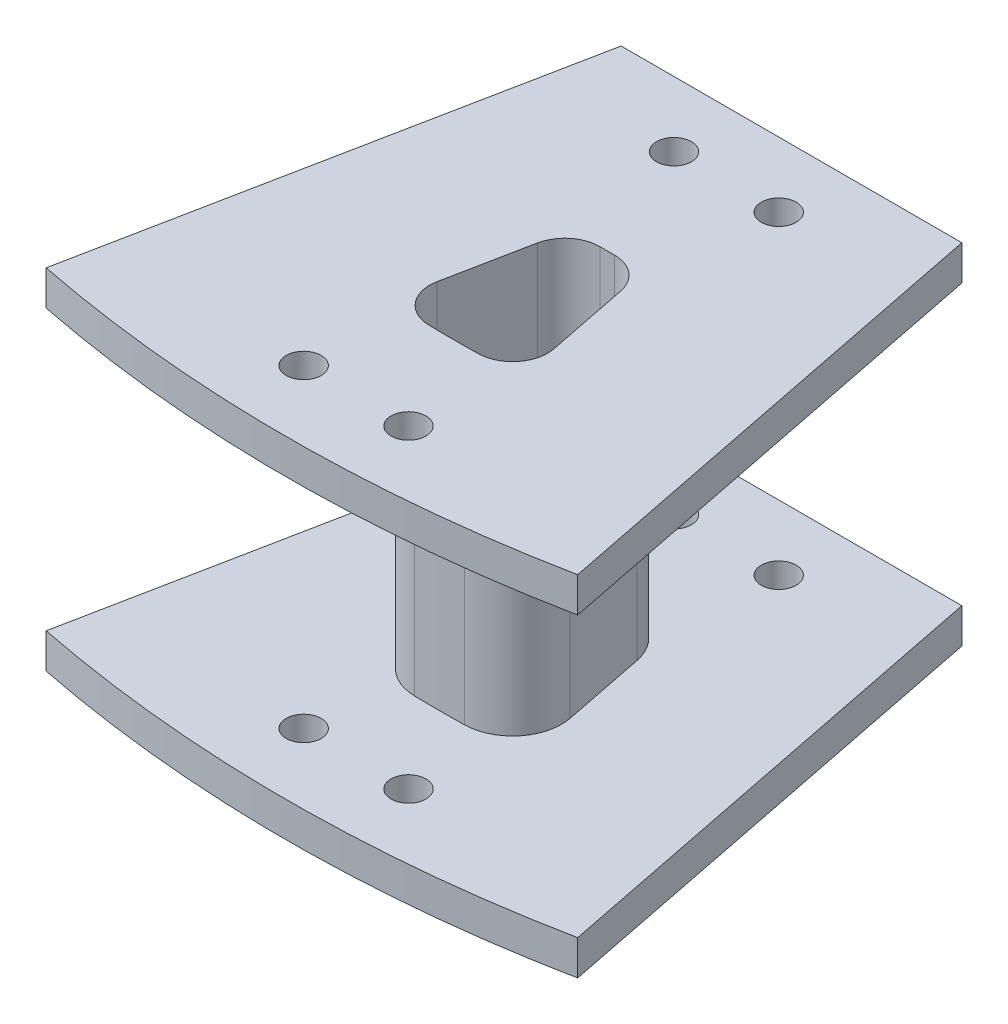
ISO-10303-21;
HEADER;
FILE_DESCRIPTION(('STEP AP214'),'2;1');
FILE_NAME('part.step','',(''),(''),'','','');
FILE_SCHEMA(('AUTOMOTIVE_DESIGN { 1 0 10303 214 1 1 1 1 }'));
ENDSEC;
DATA;
#1=APPLICATION_CONTEXT('core data for automotive mechanical design processes');
#2=APPLICATION_PROTOCOL_DEFINITION('international standard','automotive_design',2000,#1);
#3=PRODUCT_CONTEXT('',#1,'mechanical');
#4=PRODUCT('Part','Part','',(#3));
#5=PRODUCT_RELATED_PRODUCT_CATEGORY('part','',(#4));
#6=PRODUCT_DEFINITION_FORMATION('','',#4);
#7=PRODUCT_DEFINITION_CONTEXT('part definition',#1,'design');
#8=PRODUCT_DEFINITION('design','',#6,#7);
#9=PRODUCT_DEFINITION_SHAPE('','',#8);
#10=(LENGTH_UNIT() NAMED_UNIT(*) SI_UNIT(.MILLI.,.METRE.));
#11=(NAMED_UNIT(*) PLANE_ANGLE_UNIT() SI_UNIT($,.RADIAN.));
#12=(NAMED_UNIT(*) SI_UNIT($,.STERADIAN.) SOLID_ANGLE_UNIT());
#13=UNCERTAINTY_MEASURE_WITH_UNIT(LENGTH_MEASURE(1.E-05),#10,'distance_accuracy_value','');
#14=(GEOMETRIC_REPRESENTATION_CONTEXT(3) GLOBAL_UNCERTAINTY_ASSIGNED_CONTEXT((#13)) GLOBAL_UNIT_ASSIGNED_CONTEXT((#10,
#11,#12)) REPRESENTATION_CONTEXT('',''));
#15=CARTESIAN_POINT('',(0.,0.,0.));
#16=DIRECTION('',(0.,0.,1.));
#17=DIRECTION('',(1.,0.,0.));
#18=AXIS2_PLACEMENT_3D('',#15,#16,#17);
#19=CARTESIAN_POINT('',(0.,-11.,0.));
#20=DIRECTION('',(0.,1.,0.));
#21=DIRECTION('',(0.,0.,1.));
#22=AXIS2_PLACEMENT_3D('',#19,#20,#21);
#23=PLANE('',#22);
#24=CARTESIAN_POINT('',(3.75,-11.,92.4628224322584));
#25=DIRECTION('',(0.,1.,0.));
#26=DIRECTION('',(0.,0.,1.));
#27=AXIS2_PLACEMENT_3D('',#24,#25,#26);
#28=CIRCLE('',#27,1.25);
#29=CARTESIAN_POINT('',(3.75,-11.,93.7128224322584));
#30=VERTEX_POINT('',#29);
#31=EDGE_CURVE('E310',#30,#30,#28,.T.);
#32=ORIENTED_EDGE('',*,*,#31,.T.);
#33=EDGE_LOOP('',(#32));
#34=FACE_BOUND('',#33,.T.);
#35=CARTESIAN_POINT('',(-3.74999999999999,-11.,65.9628224322584));
#36=DIRECTION('',(0.,1.,0.));
#37=DIRECTION('',(0.,0.,1.));
#38=AXIS2_PLACEMENT_3D('',#35,#36,#37);
#39=CIRCLE('',#38,1.25);
#40=CARTESIAN_POINT('',(-3.74999999999999,-11.,67.2128224322584));
#41=VERTEX_POINT('',#40);
#42=EDGE_CURVE('E307',#41,#41,#39,.T.);
#43=ORIENTED_EDGE('',*,*,#42,.T.);
#44=EDGE_LOOP('',(#43));
#45=FACE_BOUND('',#44,.T.);
#46=CARTESIAN_POINT('',(3.75,-11.,65.9628224322584));
#47=DIRECTION('',(0.,1.,0.));
#48=DIRECTION('',(0.,0.,1.));
#49=AXIS2_PLACEMENT_3D('',#46,#47,#48);
#50=CIRCLE('',#49,1.25);
#51=CARTESIAN_POINT('',(3.75,-11.,67.2128224322584));
#52=VERTEX_POINT('',#51);
#53=EDGE_CURVE('E303',#52,#52,#50,.T.);
#54=ORIENTED_EDGE('',*,*,#53,.T.);
#55=EDGE_LOOP('',(#54));
#56=FACE_BOUND('',#55,.T.);
#57=CARTESIAN_POINT('',(-3.75,-11.,92.4628224322584));
#58=DIRECTION('',(0.,1.,0.));
#59=DIRECTION('',(0.,0.,1.));
#60=AXIS2_PLACEMENT_3D('',#57,#58,#59);
#61=CIRCLE('',#60,1.25);
#62=CARTESIAN_POINT('',(-3.75,-11.,93.7128224322584));
#63=VERTEX_POINT('',#62);
#64=EDGE_CURVE('E298',#63,#63,#61,.T.);
#65=ORIENTED_EDGE('',*,*,#64,.T.);
#66=EDGE_LOOP('',(#65));
#67=FACE_BOUND('',#66,.T.);
#68=CARTESIAN_POINT('',(0.,-11.,0.));
#69=DIRECTION('',(0.,-1.,0.));
#70=DIRECTION('',(0.,0.,1.));
#71=AXIS2_PLACEMENT_3D('',#68,#69,#70);
#72=CIRCLE('',#71,97.5);
#73=CARTESIAN_POINT('',(19.0213063965724,-11.,95.626564839315));
#74=VERTEX_POINT('',#73);
#75=CARTESIAN_POINT('',(-19.0213063965724,-11.,95.626564839315));
#76=VERTEX_POINT('',#75);
#77=EDGE_CURVE('E270',#74,#76,#72,.T.);
#78=ORIENTED_EDGE('',*,*,#77,.T.);
#79=DIRECTION('',(0.195090322016122,0.,-0.980785280403232));
#80=VECTOR('',#79,1.);
#81=CARTESIAN_POINT('',(-19.0213063965724,-11.,95.626564839315));
#82=LINE('',#81,#80);
#83=CARTESIAN_POINT('',(-12.1931451260081,-11.,61.2990800252019));
#84=VERTEX_POINT('',#83);
#85=EDGE_CURVE('E273',#76,#84,#82,.T.);
#86=ORIENTED_EDGE('',*,*,#85,.T.);
#87=DIRECTION('',(1.,0.,0.));
#88=VECTOR('',#87,1.);
#89=CARTESIAN_POINT('',(-12.1931451260081,-11.,61.2990800252019));
#90=LINE('',#89,#88);
#91=CARTESIAN_POINT('',(12.1931451260081,-11.,61.2990800252019));
#92=VERTEX_POINT('',#91);
#93=EDGE_CURVE('E276',#84,#92,#90,.T.);
#94=ORIENTED_EDGE('',*,*,#93,.T.);
#95=DIRECTION('',(0.195090322016122,0.,0.980785280403232));
#96=VECTOR('',#95,1.);
#97=CARTESIAN_POINT('',(19.0213063965724,-11.,95.626564839315));
#98=LINE('',#97,#96);
#99=EDGE_CURVE('E278',#92,#74,#98,.T.);
#100=ORIENTED_EDGE('',*,*,#99,.T.);
#101=EDGE_LOOP('',(#78,#86,#94,#100));
#102=FACE_BOUND('',#101,.T.);
#103=CARTESIAN_POINT('',(0.,-11.,0.));
#104=DIRECTION('',(0.,-1.,0.));
#105=DIRECTION('',(0.,0.,-1.));
#106=AXIS2_PLACEMENT_3D('',#103,#104,#105);
#107=CIRCLE('',#106,86.5);
#108=CARTESIAN_POINT('',(1.7947194017297,-11.,86.4813793961975));
#109=VERTEX_POINT('',#108);
#110=CARTESIAN_POINT('',(-1.79471940172972,-11.,86.4813793961975));
#111=VERTEX_POINT('',#110);
#112=EDGE_CURVE('E207',#109,#111,#107,.T.);
#113=ORIENTED_EDGE('',*,*,#112,.F.);
#114=CARTESIAN_POINT('',(1.72210069761349,-11.,82.9821328310335));
#115=DIRECTION('',(0.,-1.,0.));
#116=DIRECTION('',(0.,0.,-1.));
#117=AXIS2_PLACEMENT_3D('',#114,#115,#116);
#118=CIRCLE('',#117,3.5);
#119=CARTESIAN_POINT('',(5.1548491790248,-11.,82.299316703977));
#120=VERTEX_POINT('',#119);
#121=EDGE_CURVE('E250',#120,#109,#118,.T.);
#122=ORIENTED_EDGE('',*,*,#121,.F.);
#123=DIRECTION('',(0.195090322016121,0.,0.980785280403232));
#124=VECTOR('',#123,1.);
#125=CARTESIAN_POINT('',(3.96456366045838,-11.,76.3153473095823));
#126=LINE('',#125,#124);
#127=CARTESIAN_POINT('',(3.96456366045838,-11.,76.3153473095823));
#128=VERTEX_POINT('',#127);
#129=EDGE_CURVE('E247',#128,#120,#126,.T.);
#130=ORIENTED_EDGE('',*,*,#129,.F.);
#131=CARTESIAN_POINT('',(0.531815179047067,-11.,76.9981634366388));
#132=DIRECTION('',(0.,-1.,0.));
#133=DIRECTION('',(0.,0.,-1.));
#134=AXIS2_PLACEMENT_3D('',#131,#132,#133);
#135=CIRCLE('',#134,3.50000000000001);
#136=CARTESIAN_POINT('',(0.507641761817665,-11.,73.4982469167915));
#137=VERTEX_POINT('',#136);
#138=EDGE_CURVE('E244',#137,#128,#135,.T.);
#139=ORIENTED_EDGE('',*,*,#138,.F.);
#140=CARTESIAN_POINT('',(0.,-11.,0.));
#141=DIRECTION('',(0.,1.,0.));
#142=DIRECTION('',(0.,0.,-1.));
#143=AXIS2_PLACEMENT_3D('',#140,#141,#142);
#144=CIRCLE('',#143,73.5);
#145=CARTESIAN_POINT('',(-0.507641761817631,-11.,73.4982469167915));
#146=VERTEX_POINT('',#145);
#147=EDGE_CURVE('E241',#146,#137,#144,.T.);
#148=ORIENTED_EDGE('',*,*,#147,.F.);
#149=CARTESIAN_POINT('',(-0.531815179047067,-11.,76.9981634366388));
#150=DIRECTION('',(0.,-1.,0.));
#151=DIRECTION('',(0.,0.,-1.));
#152=AXIS2_PLACEMENT_3D('',#149,#150,#151);
#153=CIRCLE('',#152,3.50000000000001);
#154=CARTESIAN_POINT('',(-3.96456366045838,-11.,76.3153473095823));
#155=VERTEX_POINT('',#154);
#156=EDGE_CURVE('E238',#155,#146,#153,.T.);
#157=ORIENTED_EDGE('',*,*,#156,.F.);
#158=DIRECTION('',(0.195090322016122,0.,-0.980785280403232));
#159=VECTOR('',#158,1.);
#160=CARTESIAN_POINT('',(-5.1548491790248,-11.,82.299316703977));
#161=LINE('',#160,#159);
#162=CARTESIAN_POINT('',(-5.15484917902481,-11.,82.299316703977));
#163=VERTEX_POINT('',#162);
#164=EDGE_CURVE('E210',#163,#155,#161,.T.);
#165=ORIENTED_EDGE('',*,*,#164,.F.);
#166=CARTESIAN_POINT('',(-1.72210069761349,-11.,82.9821328310335));
#167=DIRECTION('',(0.,-1.,0.));
#168=DIRECTION('',(0.,0.,-1.));
#169=AXIS2_PLACEMENT_3D('',#166,#167,#168);
#170=CIRCLE('',#169,3.5);
#171=EDGE_CURVE('E204',#111,#163,#170,.T.);
#172=ORIENTED_EDGE('',*,*,#171,.F.);
#173=EDGE_LOOP('',(#113,#122,#130,#139,#148,#157,#165,#172));
#174=FACE_BOUND('',#173,.T.);
#175=ADVANCED_FACE('F34',(#34,#45,#56,#67,#102,#174),#23,.F.);
#176=CARTESIAN_POINT('',(0.,-8.5,0.));
#177=DIRECTION('',(0.,1.,0.));
#178=DIRECTION('',(0.,0.,1.));
#179=AXIS2_PLACEMENT_3D('',#176,#177,#178);
#180=PLANE('',#179);
#181=CARTESIAN_POINT('',(-0.531815179047067,-8.5,76.9981634366388));
#182=DIRECTION('',(0.,1.,0.));
#183=DIRECTION('',(0.,0.,1.));
#184=AXIS2_PLACEMENT_3D('',#181,#182,#183);
#185=CIRCLE('',#184,2.50000000000001);
#186=CARTESIAN_POINT('',(-0.514548452454617,-8.5,74.4982230653193));
#187=VERTEX_POINT('',#186);
#188=CARTESIAN_POINT('',(-2.98377838005515,-8.5,76.5104376315984));
#189=VERTEX_POINT('',#188);
#190=EDGE_CURVE('E346',#187,#189,#185,.T.);
#191=ORIENTED_EDGE('',*,*,#190,.F.);
#192=CARTESIAN_POINT('',(0.,-8.5,0.));
#193=DIRECTION('',(0.,1.,0.));
#194=DIRECTION('',(0.,0.,1.));
#195=AXIS2_PLACEMENT_3D('',#192,#193,#194);
#196=CIRCLE('',#195,74.5);
#197=CARTESIAN_POINT('',(0.51454845245463,-8.5,74.4982230653193));
#198=VERTEX_POINT('',#197);
#199=EDGE_CURVE('E344',#198,#187,#196,.F.);
#200=ORIENTED_EDGE('',*,*,#199,.F.);
#201=CARTESIAN_POINT('',(0.531815179047067,-8.5,76.9981634366388));
#202=DIRECTION('',(0.,1.,0.));
#203=DIRECTION('',(0.,0.,1.));
#204=AXIS2_PLACEMENT_3D('',#201,#202,#203);
#205=CIRCLE('',#204,2.5);
#206=CARTESIAN_POINT('',(2.98377838005515,-8.5,76.5104376315985));
#207=VERTEX_POINT('',#206);
#208=EDGE_CURVE('E342',#207,#198,#205,.T.);
#209=ORIENTED_EDGE('',*,*,#208,.F.);
#210=DIRECTION('',(-0.195090322016122,0.,-0.980785280403232));
#211=VECTOR('',#210,1.);
#212=CARTESIAN_POINT('',(4.17406389862157,-8.49999999999999,82.4944070259932));
#213=LINE('',#212,#211);
#214=CARTESIAN_POINT('',(4.17406389862157,-8.5,82.4944070259932));
#215=VERTEX_POINT('',#214);
#216=EDGE_CURVE('E38',#215,#207,#213,.T.);
#217=ORIENTED_EDGE('',*,*,#216,.F.);
#218=CARTESIAN_POINT('',(1.72210069761349,-8.5,82.9821328310335));
#219=DIRECTION('',(0.,1.,0.));
#220=DIRECTION('',(0.,0.,1.));
#221=AXIS2_PLACEMENT_3D('',#218,#219,#220);
#222=CIRCLE('',#221,2.5);
#223=CARTESIAN_POINT('',(1.77397120055364,-8.5,85.4815946632935));
#224=VERTEX_POINT('',#223);
#225=EDGE_CURVE('E68',#224,#215,#222,.T.);
#226=ORIENTED_EDGE('',*,*,#225,.F.);
#227=CARTESIAN_POINT('',(0.,-8.5,0.));
#228=DIRECTION('',(0.,1.,0.));
#229=DIRECTION('',(0.,0.,1.));
#230=AXIS2_PLACEMENT_3D('',#227,#228,#229);
#231=CIRCLE('',#230,85.5);
#232=CARTESIAN_POINT('',(-1.77397120055366,-8.5,85.4815946632935));
#233=VERTEX_POINT('',#232);
#234=EDGE_CURVE('E317',#233,#224,#231,.T.);
#235=ORIENTED_EDGE('',*,*,#234,.F.);
#236=CARTESIAN_POINT('',(-1.72210069761349,-8.5,82.9821328310335));
#237=DIRECTION('',(0.,1.,0.));
#238=DIRECTION('',(0.,0.,1.));
#239=AXIS2_PLACEMENT_3D('',#236,#237,#238);
#240=CIRCLE('',#239,2.5);
#241=CARTESIAN_POINT('',(-4.17406389862157,-8.5,82.4944070259932));
#242=VERTEX_POINT('',#241);
#243=EDGE_CURVE('E312',#242,#233,#240,.T.);
#244=ORIENTED_EDGE('',*,*,#243,.F.);
#245=DIRECTION('',(-0.195090322016121,0.,0.980785280403232));
#246=VECTOR('',#245,1.);
#247=CARTESIAN_POINT('',(-2.98377838005514,-8.5,76.5104376315984));
#248=LINE('',#247,#246);
#249=EDGE_CURVE('E311',#189,#242,#248,.T.);
#250=ORIENTED_EDGE('',*,*,#249,.F.);
#251=EDGE_LOOP('',(#191,#200,#209,#217,#226,#235,#244,#250));
#252=FACE_BOUND('',#251,.T.);
#253=CARTESIAN_POINT('',(3.75,-8.5,92.4628224322584));
#254=DIRECTION('',(0.,-1.,0.));
#255=DIRECTION('',(0.,0.,-1.));
#256=AXIS2_PLACEMENT_3D('',#253,#254,#255);
#257=CIRCLE('',#256,1.25);
#258=CARTESIAN_POINT('',(3.75,-8.5,91.2128224322584));
#259=VERTEX_POINT('',#258);
#260=EDGE_CURVE('E355',#259,#259,#257,.T.);
#261=ORIENTED_EDGE('',*,*,#260,.T.);
#262=EDGE_LOOP('',(#261));
#263=FACE_BOUND('',#262,.T.);
#264=CARTESIAN_POINT('',(-3.74999999999999,-8.5,65.9628224322584));
#265=DIRECTION('',(0.,-1.,0.));
#266=DIRECTION('',(0.,0.,-1.));
#267=AXIS2_PLACEMENT_3D('',#264,#265,#266);
#268=CIRCLE('',#267,1.25);
#269=CARTESIAN_POINT('',(-3.74999999999999,-8.5,64.7128224322584));
#270=VERTEX_POINT('',#269);
#271=EDGE_CURVE('E362',#270,#270,#268,.T.);
#272=ORIENTED_EDGE('',*,*,#271,.T.);
#273=EDGE_LOOP('',(#272));
#274=FACE_BOUND('',#273,.T.);
#275=CARTESIAN_POINT('',(3.75,-8.5,65.9628224322584));
#276=DIRECTION('',(0.,-1.,0.));
#277=DIRECTION('',(0.,0.,-1.));
#278=AXIS2_PLACEMENT_3D('',#275,#276,#277);
#279=CIRCLE('',#278,1.25);
#280=CARTESIAN_POINT('',(3.75,-8.5,64.7128224322584));
#281=VERTEX_POINT('',#280);
#282=EDGE_CURVE('E349',#281,#281,#279,.T.);
#283=ORIENTED_EDGE('',*,*,#282,.T.);
#284=EDGE_LOOP('',(#283));
#285=FACE_BOUND('',#284,.T.);
#286=CARTESIAN_POINT('',(-3.75,-8.5,92.4628224322584));
#287=DIRECTION('',(0.,-1.,0.));
#288=DIRECTION('',(0.,0.,-1.));
#289=AXIS2_PLACEMENT_3D('',#286,#287,#288);
#290=CIRCLE('',#289,1.25);
#291=CARTESIAN_POINT('',(-3.75,-8.5,91.2128224322584));
#292=VERTEX_POINT('',#291);
#293=EDGE_CURVE('E299',#292,#292,#290,.T.);
#294=ORIENTED_EDGE('',*,*,#293,.T.);
#295=EDGE_LOOP('',(#294));
#296=FACE_BOUND('',#295,.T.);
#297=CARTESIAN_POINT('',(0.,-8.5,0.));
#298=DIRECTION('',(0.,-1.,0.));
#299=DIRECTION('',(0.,0.,1.));
#300=AXIS2_PLACEMENT_3D('',#297,#298,#299);
#301=CIRCLE('',#300,97.5);
#302=CARTESIAN_POINT('',(19.0213063965724,-8.5,95.626564839315));
#303=VERTEX_POINT('',#302);
#304=CARTESIAN_POINT('',(-19.0213063965724,-8.5,95.626564839315));
#305=VERTEX_POINT('',#304);
#306=EDGE_CURVE('E221',#303,#305,#301,.T.);
#307=ORIENTED_EDGE('',*,*,#306,.F.);
#308=DIRECTION('',(0.195090322016122,0.,0.980785280403232));
#309=VECTOR('',#308,1.);
#310=CARTESIAN_POINT('',(19.0213063965724,-8.5,95.626564839315));
#311=LINE('',#310,#309);
#312=CARTESIAN_POINT('',(12.1931451260081,-8.5,61.2990800252019));
#313=VERTEX_POINT('',#312);
#314=EDGE_CURVE('E274',#313,#303,#311,.T.);
#315=ORIENTED_EDGE('',*,*,#314,.F.);
#316=DIRECTION('',(1.,0.,0.));
#317=VECTOR('',#316,1.);
#318=CARTESIAN_POINT('',(-12.1931451260081,-8.5,61.2990800252019));
#319=LINE('',#318,#317);
#320=CARTESIAN_POINT('',(-12.1931451260081,-8.5,61.2990800252019));
#321=VERTEX_POINT('',#320);
#322=EDGE_CURVE('E285',#321,#313,#319,.T.);
#323=ORIENTED_EDGE('',*,*,#322,.F.);
#324=DIRECTION('',(0.195090322016122,0.,-0.980785280403232));
#325=VECTOR('',#324,1.);
#326=CARTESIAN_POINT('',(-19.0213063965724,-8.5,95.626564839315));
#327=LINE('',#326,#325);
#328=EDGE_CURVE('E283',#305,#321,#327,.T.);
#329=ORIENTED_EDGE('',*,*,#328,.F.);
#330=EDGE_LOOP('',(#307,#315,#323,#329));
#331=FACE_BOUND('',#330,.T.);
#332=ADVANCED_FACE('F451',(#252,#263,#274,#285,#296,#331),#180,.T.);
#333=CARTESIAN_POINT('',(0.,-11.,0.));
#334=DIRECTION('',(0.,1.,0.));
#335=DIRECTION('',(0.,0.,1.));
#336=AXIS2_PLACEMENT_3D('',#333,#334,#335);
#337=CYLINDRICAL_SURFACE('',#336,97.5);
#338=ORIENTED_EDGE('',*,*,#306,.T.);
#339=DIRECTION('',(0.,1.,0.));
#340=VECTOR('',#339,1.);
#341=CARTESIAN_POINT('',(-19.0213063965724,-11.,95.626564839315));
#342=LINE('',#341,#340);
#343=EDGE_CURVE('E11',#76,#305,#342,.T.);
#344=ORIENTED_EDGE('',*,*,#343,.F.);
#345=ORIENTED_EDGE('',*,*,#77,.F.);
#346=DIRECTION('',(0.,1.,0.));
#347=VECTOR('',#346,1.);
#348=CARTESIAN_POINT('',(19.0213063965724,-11.,95.626564839315));
#349=LINE('',#348,#347);
#350=EDGE_CURVE('E280',#74,#303,#349,.T.);
#351=ORIENTED_EDGE('',*,*,#350,.T.);
#352=EDGE_LOOP('',(#338,#344,#345,#351));
#353=FACE_BOUND('',#352,.T.);
#354=ADVANCED_FACE('F36',(#353),#337,.T.);
#355=CARTESIAN_POINT('',(-19.0213063965724,-11.,95.626564839315));
#356=DIRECTION('',(0.980785280403232,0.,0.195090322016122));
#357=DIRECTION('',(0.195090322016122,0.,-0.980785280403232));
#358=AXIS2_PLACEMENT_3D('',#355,#356,#357);
#359=PLANE('',#358);
#360=ORIENTED_EDGE('',*,*,#328,.T.);
#361=DIRECTION('',(0.,1.,0.));
#362=VECTOR('',#361,1.);
#363=CARTESIAN_POINT('',(-12.1931451260081,-11.,61.2990800252019));
#364=LINE('',#363,#362);
#365=EDGE_CURVE('E44',#84,#321,#364,.T.);
#366=ORIENTED_EDGE('',*,*,#365,.F.);
#367=ORIENTED_EDGE('',*,*,#85,.F.);
#368=ORIENTED_EDGE('',*,*,#343,.T.);
#369=EDGE_LOOP('',(#360,#366,#367,#368));
#370=FACE_BOUND('',#369,.T.);
#371=ADVANCED_FACE('F468',(#370),#359,.F.);
#372=CARTESIAN_POINT('',(-12.1931451260081,-11.,61.2990800252019));
#373=DIRECTION('',(0.,0.,1.));
#374=DIRECTION('',(1.,0.,0.));
#375=AXIS2_PLACEMENT_3D('',#372,#373,#374);
#376=PLANE('',#375);
#377=ORIENTED_EDGE('',*,*,#322,.T.);
#378=DIRECTION('',(0.,1.,0.));
#379=VECTOR('',#378,1.);
#380=CARTESIAN_POINT('',(12.1931451260081,-11.,61.2990800252019));
#381=LINE('',#380,#379);
#382=EDGE_CURVE('E290',#92,#313,#381,.T.);
#383=ORIENTED_EDGE('',*,*,#382,.F.);
#384=ORIENTED_EDGE('',*,*,#93,.F.);
#385=ORIENTED_EDGE('',*,*,#365,.T.);
#386=EDGE_LOOP('',(#377,#383,#384,#385));
#387=FACE_BOUND('',#386,.T.);
#388=ADVANCED_FACE('F465',(#387),#376,.F.);
#389=CARTESIAN_POINT('',(19.0213063965724,-11.,95.626564839315));
#390=DIRECTION('',(-0.980785280403232,0.,0.195090322016122));
#391=DIRECTION('',(0.195090322016122,0.,0.980785280403232));
#392=AXIS2_PLACEMENT_3D('',#389,#390,#391);
#393=PLANE('',#392);
#394=ORIENTED_EDGE('',*,*,#314,.T.);
#395=ORIENTED_EDGE('',*,*,#350,.F.);
#396=ORIENTED_EDGE('',*,*,#99,.F.);
#397=ORIENTED_EDGE('',*,*,#382,.T.);
#398=EDGE_LOOP('',(#394,#395,#396,#397));
#399=FACE_BOUND('',#398,.T.);
#400=ADVANCED_FACE('F462',(#399),#393,.F.);
#401=CARTESIAN_POINT('',(0.,-31.,0.));
#402=DIRECTION('',(0.,1.,0.));
#403=DIRECTION('',(0.,0.,1.));
#404=AXIS2_PLACEMENT_3D('',#401,#402,#403);
#405=CYLINDRICAL_SURFACE('',#404,86.5);
#406=ORIENTED_EDGE('',*,*,#112,.T.);
#407=DIRECTION('',(0.,1.,0.));
#408=VECTOR('',#407,1.);
#409=CARTESIAN_POINT('',(-1.79471940172972,-31.,86.4813793961975));
#410=LINE('',#409,#408);
#411=CARTESIAN_POINT('',(-1.79471940172972,-31.,86.4813793961975));
#412=VERTEX_POINT('',#411);
#413=EDGE_CURVE('E215',#412,#111,#410,.T.);
#414=ORIENTED_EDGE('',*,*,#413,.F.);
#415=CARTESIAN_POINT('',(0.,-31.,0.));
#416=DIRECTION('',(0.,-1.,0.));
#417=DIRECTION('',(0.,0.,-1.));
#418=AXIS2_PLACEMENT_3D('',#415,#416,#417);
#419=CIRCLE('',#418,86.5);
#420=CARTESIAN_POINT('',(1.7947194017297,-31.,86.4813793961975));
#421=VERTEX_POINT('',#420);
#422=EDGE_CURVE('E252',#421,#412,#419,.T.);
#423=ORIENTED_EDGE('',*,*,#422,.F.);
#424=DIRECTION('',(0.,1.,0.));
#425=VECTOR('',#424,1.);
#426=CARTESIAN_POINT('',(1.7947194017297,-31.,86.4813793961975));
#427=LINE('',#426,#425);
#428=EDGE_CURVE('E227',#421,#109,#427,.T.);
#429=ORIENTED_EDGE('',*,*,#428,.T.);
#430=EDGE_LOOP('',(#406,#414,#423,#429));
#431=FACE_BOUND('',#430,.T.);
#432=ADVANCED_FACE('F225',(#431),#405,.T.);
#433=CARTESIAN_POINT('',(-1.72210069761349,-31.,82.9821328310335));
#434=DIRECTION('',(0.,1.,0.));
#435=DIRECTION('',(0.,0.,1.));
#436=AXIS2_PLACEMENT_3D('',#433,#434,#435);
#437=CYLINDRICAL_SURFACE('',#436,3.5);
#438=ORIENTED_EDGE('',*,*,#171,.T.);
#439=DIRECTION('',(0.,1.,0.));
#440=VECTOR('',#439,1.);
#441=CARTESIAN_POINT('',(-5.15484917902481,-31.,82.299316703977));
#442=LINE('',#441,#440);
#443=CARTESIAN_POINT('',(-5.15484917902481,-31.,82.299316703977));
#444=VERTEX_POINT('',#443);
#445=EDGE_CURVE('E222',#444,#163,#442,.T.);
#446=ORIENTED_EDGE('',*,*,#445,.F.);
#447=CARTESIAN_POINT('',(-1.72210069761349,-31.,82.9821328310335));
#448=DIRECTION('',(0.,-1.,0.));
#449=DIRECTION('',(0.,0.,-1.));
#450=AXIS2_PLACEMENT_3D('',#447,#448,#449);
#451=CIRCLE('',#450,3.5);
#452=EDGE_CURVE('E218',#412,#444,#451,.T.);
#453=ORIENTED_EDGE('',*,*,#452,.F.);
#454=ORIENTED_EDGE('',*,*,#413,.T.);
#455=EDGE_LOOP('',(#438,#446,#453,#454));
#456=FACE_BOUND('',#455,.T.);
#457=ADVANCED_FACE('F216',(#456),#437,.T.);
#458=CARTESIAN_POINT('',(-5.1548491790248,-31.,82.299316703977));
#459=DIRECTION('',(0.980785280403232,0.,0.195090322016122));
#460=DIRECTION('',(0.195090322016122,0.,-0.980785280403232));
#461=AXIS2_PLACEMENT_3D('',#458,#459,#460);
#462=PLANE('',#461);
#463=ORIENTED_EDGE('',*,*,#164,.T.);
#464=DIRECTION('',(0.,1.,0.));
#465=VECTOR('',#464,1.);
#466=CARTESIAN_POINT('',(-3.96456366045838,-31.,76.3153473095823));
#467=LINE('',#466,#465);
#468=CARTESIAN_POINT('',(-3.96456366045838,-31.,76.3153473095823));
#469=VERTEX_POINT('',#468);
#470=EDGE_CURVE('E266',#469,#155,#467,.T.);
#471=ORIENTED_EDGE('',*,*,#470,.F.);
#472=DIRECTION('',(0.195090322016122,0.,-0.980785280403232));
#473=VECTOR('',#472,1.);
#474=CARTESIAN_POINT('',(-5.1548491790248,-31.,82.299316703977));
#475=LINE('',#474,#473);
#476=EDGE_CURVE('E407',#444,#469,#475,.T.);
#477=ORIENTED_EDGE('',*,*,#476,.F.);
#478=ORIENTED_EDGE('',*,*,#445,.T.);
#479=EDGE_LOOP('',(#463,#471,#477,#478));
#480=FACE_BOUND('',#479,.T.);
#481=ADVANCED_FACE('F440',(#480),#462,.F.);
#482=CARTESIAN_POINT('',(-0.531815179047067,-31.,76.9981634366388));
#483=DIRECTION('',(0.,1.,0.));
#484=DIRECTION('',(0.,0.,1.));
#485=AXIS2_PLACEMENT_3D('',#482,#483,#484);
#486=CYLINDRICAL_SURFACE('',#485,3.50000000000001);
#487=ORIENTED_EDGE('',*,*,#156,.T.);
#488=DIRECTION('',(0.,1.,0.));
#489=VECTOR('',#488,1.);
#490=CARTESIAN_POINT('',(-0.507641761817631,-31.,73.4982469167915));
#491=LINE('',#490,#489);
#492=CARTESIAN_POINT('',(-0.507641761817631,-31.,73.4982469167915));
#493=VERTEX_POINT('',#492);
#494=EDGE_CURVE('E263',#493,#146,#491,.T.);
#495=ORIENTED_EDGE('',*,*,#494,.F.);
#496=CARTESIAN_POINT('',(-0.531815179047067,-31.,76.9981634366388));
#497=DIRECTION('',(0.,-1.,0.));
#498=DIRECTION('',(0.,0.,-1.));
#499=AXIS2_PLACEMENT_3D('',#496,#497,#498);
#500=CIRCLE('',#499,3.50000000000001);
#501=EDGE_CURVE('E410',#469,#493,#500,.T.);
#502=ORIENTED_EDGE('',*,*,#501,.F.);
#503=ORIENTED_EDGE('',*,*,#470,.T.);
#504=EDGE_LOOP('',(#487,#495,#502,#503));
#505=FACE_BOUND('',#504,.T.);
#506=ADVANCED_FACE('F438',(#505),#486,.T.);
#507=CARTESIAN_POINT('',(0.,-31.,0.));
#508=DIRECTION('',(0.,1.,0.));
#509=DIRECTION('',(0.,0.,1.));
#510=AXIS2_PLACEMENT_3D('',#507,#508,#509);
#511=CYLINDRICAL_SURFACE('',#510,73.5);
#512=ORIENTED_EDGE('',*,*,#147,.T.);
#513=DIRECTION('',(0.,1.,0.));
#514=VECTOR('',#513,1.);
#515=CARTESIAN_POINT('',(0.507641761817665,-31.,73.4982469167915));
#516=LINE('',#515,#514);
#517=CARTESIAN_POINT('',(0.507641761817665,-31.,73.4982469167915));
#518=VERTEX_POINT('',#517);
#519=EDGE_CURVE('E260',#518,#137,#516,.T.);
#520=ORIENTED_EDGE('',*,*,#519,.F.);
#521=CARTESIAN_POINT('',(0.,-31.,0.));
#522=DIRECTION('',(0.,1.,0.));
#523=DIRECTION('',(0.,0.,-1.));
#524=AXIS2_PLACEMENT_3D('',#521,#522,#523);
#525=CIRCLE('',#524,73.5);
#526=EDGE_CURVE('E413',#493,#518,#525,.T.);
#527=ORIENTED_EDGE('',*,*,#526,.F.);
#528=ORIENTED_EDGE('',*,*,#494,.T.);
#529=EDGE_LOOP('',(#512,#520,#527,#528));
#530=FACE_BOUND('',#529,.T.);
#531=ADVANCED_FACE('F434',(#530),#511,.F.);
#532=CARTESIAN_POINT('',(0.531815179047067,-31.,76.9981634366388));
#533=DIRECTION('',(0.,1.,0.));
#534=DIRECTION('',(0.,0.,1.));
#535=AXIS2_PLACEMENT_3D('',#532,#533,#534);
#536=CYLINDRICAL_SURFACE('',#535,3.50000000000001);
#537=ORIENTED_EDGE('',*,*,#138,.T.);
#538=DIRECTION('',(0.,1.,0.));
#539=VECTOR('',#538,1.);
#540=CARTESIAN_POINT('',(3.96456366045838,-31.,76.3153473095823));
#541=LINE('',#540,#539);
#542=CARTESIAN_POINT('',(3.96456366045838,-31.,76.3153473095823));
#543=VERTEX_POINT('',#542);
#544=EDGE_CURVE('E257',#543,#128,#541,.T.);
#545=ORIENTED_EDGE('',*,*,#544,.F.);
#546=CARTESIAN_POINT('',(0.531815179047067,-31.,76.9981634366388));
#547=DIRECTION('',(0.,-1.,0.));
#548=DIRECTION('',(0.,0.,-1.));
#549=AXIS2_PLACEMENT_3D('',#546,#547,#548);
#550=CIRCLE('',#549,3.50000000000001);
#551=EDGE_CURVE('E416',#518,#543,#550,.T.);
#552=ORIENTED_EDGE('',*,*,#551,.F.);
#553=ORIENTED_EDGE('',*,*,#519,.T.);
#554=EDGE_LOOP('',(#537,#545,#552,#553));
#555=FACE_BOUND('',#554,.T.);
#556=ADVANCED_FACE('F432',(#555),#536,.T.);
#557=CARTESIAN_POINT('',(3.96456366045838,-31.,76.3153473095823));
#558=DIRECTION('',(-0.980785280403232,0.,0.195090322016121));
#559=DIRECTION('',(0.195090322016121,0.,0.980785280403232));
#560=AXIS2_PLACEMENT_3D('',#557,#558,#559);
#561=PLANE('',#560);
#562=ORIENTED_EDGE('',*,*,#129,.T.);
#563=DIRECTION('',(0.,1.,0.));
#564=VECTOR('',#563,1.);
#565=CARTESIAN_POINT('',(5.1548491790248,-31.,82.299316703977));
#566=LINE('',#565,#564);
#567=CARTESIAN_POINT('',(5.1548491790248,-31.,82.299316703977));
#568=VERTEX_POINT('',#567);
#569=EDGE_CURVE('E254',#568,#120,#566,.T.);
#570=ORIENTED_EDGE('',*,*,#569,.F.);
#571=DIRECTION('',(0.195090322016121,0.,0.980785280403232));
#572=VECTOR('',#571,1.);
#573=CARTESIAN_POINT('',(3.96456366045838,-31.,76.3153473095823));
#574=LINE('',#573,#572);
#575=EDGE_CURVE('E418',#543,#568,#574,.T.);
#576=ORIENTED_EDGE('',*,*,#575,.F.);
#577=ORIENTED_EDGE('',*,*,#544,.T.);
#578=EDGE_LOOP('',(#562,#570,#576,#577));
#579=FACE_BOUND('',#578,.T.);
#580=ADVANCED_FACE('F429',(#579),#561,.F.);
#581=CARTESIAN_POINT('',(1.72210069761349,-31.,82.9821328310335));
#582=DIRECTION('',(0.,1.,0.));
#583=DIRECTION('',(0.,0.,1.));
#584=AXIS2_PLACEMENT_3D('',#581,#582,#583);
#585=CYLINDRICAL_SURFACE('',#584,3.5);
#586=ORIENTED_EDGE('',*,*,#121,.T.);
#587=ORIENTED_EDGE('',*,*,#428,.F.);
#588=CARTESIAN_POINT('',(1.72210069761349,-31.,82.9821328310335));
#589=DIRECTION('',(0.,-1.,0.));
#590=DIRECTION('',(0.,0.,-1.));
#591=AXIS2_PLACEMENT_3D('',#588,#589,#590);
#592=CIRCLE('',#591,3.5);
#593=EDGE_CURVE('E234',#568,#421,#592,.T.);
#594=ORIENTED_EDGE('',*,*,#593,.F.);
#595=ORIENTED_EDGE('',*,*,#569,.T.);
#596=EDGE_LOOP('',(#586,#587,#594,#595));
#597=FACE_BOUND('',#596,.T.);
#598=ADVANCED_FACE('F427',(#597),#585,.T.);
#599=CARTESIAN_POINT('',(0.,-33.5,0.));
#600=DIRECTION('',(0.,-1.,0.));
#601=DIRECTION('',(0.,0.,-1.));
#602=AXIS2_PLACEMENT_3D('',#599,#600,#601);
#603=PLANE('',#602);
#604=CARTESIAN_POINT('',(-0.531815179047067,-33.5,76.9981634366388));
#605=DIRECTION('',(0.,1.,0.));
#606=DIRECTION('',(0.,0.,1.));
#607=AXIS2_PLACEMENT_3D('',#604,#605,#606);
#608=CIRCLE('',#607,2.50000000000001);
#609=CARTESIAN_POINT('',(-0.514548452454617,-33.5,74.4982230653193));
#610=VERTEX_POINT('',#609);
#611=CARTESIAN_POINT('',(-2.98377838005514,-33.5,76.5104376315984));
#612=VERTEX_POINT('',#611);
#613=EDGE_CURVE('E861',#610,#612,#608,.T.);
#614=ORIENTED_EDGE('',*,*,#613,.T.);
#615=DIRECTION('',(-0.195090322016121,0.,0.980785280403232));
#616=VECTOR('',#615,1.);
#617=CARTESIAN_POINT('',(-2.98377838005514,-33.5,76.5104376315984));
#618=LINE('',#617,#616);
#619=CARTESIAN_POINT('',(-4.17406389862157,-33.5,82.4944070259932));
#620=VERTEX_POINT('',#619);
#621=EDGE_CURVE('E853',#612,#620,#618,.T.);
#622=ORIENTED_EDGE('',*,*,#621,.T.);
#623=CARTESIAN_POINT('',(-1.72210069761349,-33.5,82.9821328310335));
#624=DIRECTION('',(0.,1.,0.));
#625=DIRECTION('',(0.,0.,1.));
#626=AXIS2_PLACEMENT_3D('',#623,#624,#625);
#627=CIRCLE('',#626,2.5);
#628=CARTESIAN_POINT('',(-1.77397120055366,-33.5,85.4815946632935));
#629=VERTEX_POINT('',#628);
#630=EDGE_CURVE('E851',#620,#629,#627,.T.);
#631=ORIENTED_EDGE('',*,*,#630,.T.);
#632=CARTESIAN_POINT('',(0.,-33.5,0.));
#633=DIRECTION('',(0.,1.,0.));
#634=DIRECTION('',(0.,0.,1.));
#635=AXIS2_PLACEMENT_3D('',#632,#633,#634);
#636=CIRCLE('',#635,85.5);
#637=CARTESIAN_POINT('',(1.77397120055364,-33.5,85.4815946632935));
#638=VERTEX_POINT('',#637);
#639=EDGE_CURVE('E837',#629,#638,#636,.T.);
#640=ORIENTED_EDGE('',*,*,#639,.T.);
#641=CARTESIAN_POINT('',(1.72210069761349,-33.5,82.9821328310335));
#642=DIRECTION('',(0.,1.,0.));
#643=DIRECTION('',(0.,0.,1.));
#644=AXIS2_PLACEMENT_3D('',#641,#642,#643);
#645=CIRCLE('',#644,2.5);
#646=CARTESIAN_POINT('',(4.17406389862157,-33.5,82.4944070259932));
#647=VERTEX_POINT('',#646);
#648=EDGE_CURVE('E847',#638,#647,#645,.T.);
#649=ORIENTED_EDGE('',*,*,#648,.T.);
#650=DIRECTION('',(-0.195090322016122,0.,-0.980785280403232));
#651=VECTOR('',#650,1.);
#652=CARTESIAN_POINT('',(4.17406389862157,-33.5,82.4944070259932));
#653=LINE('',#652,#651);
#654=CARTESIAN_POINT('',(2.98377838005514,-33.5,76.5104376315985));
#655=VERTEX_POINT('',#654);
#656=EDGE_CURVE('E844',#647,#655,#653,.T.);
#657=ORIENTED_EDGE('',*,*,#656,.T.);
#658=CARTESIAN_POINT('',(0.531815179047067,-33.5,76.9981634366388));
#659=DIRECTION('',(0.,1.,0.));
#660=DIRECTION('',(0.,0.,1.));
#661=AXIS2_PLACEMENT_3D('',#658,#659,#660);
#662=CIRCLE('',#661,2.5);
#663=CARTESIAN_POINT('',(0.51454845245463,-33.5,74.4982230653193));
#664=VERTEX_POINT('',#663);
#665=EDGE_CURVE('E857',#655,#664,#662,.T.);
#666=ORIENTED_EDGE('',*,*,#665,.T.);
#667=CARTESIAN_POINT('',(0.,-33.5,0.));
#668=DIRECTION('',(0.,-1.,0.));
#669=DIRECTION('',(0.,0.,1.));
#670=AXIS2_PLACEMENT_3D('',#667,#668,#669);
#671=CIRCLE('',#670,74.5);
#672=EDGE_CURVE('E326',#664,#610,#671,.T.);
#673=ORIENTED_EDGE('',*,*,#672,.T.);
#674=EDGE_LOOP('',(#614,#622,#631,#640,#649,#657,#666,#673));
#675=FACE_BOUND('',#674,.T.);
#676=CARTESIAN_POINT('',(3.75,-33.5,92.4628224322584));
#677=DIRECTION('',(0.,-1.,0.));
#678=DIRECTION('',(0.,0.,-1.));
#679=AXIS2_PLACEMENT_3D('',#676,#677,#678);
#680=CIRCLE('',#679,1.25);
#681=CARTESIAN_POINT('',(3.75,-33.5,91.2128224322584));
#682=VERTEX_POINT('',#681);
#683=EDGE_CURVE('E359',#682,#682,#680,.T.);
#684=ORIENTED_EDGE('',*,*,#683,.F.);
#685=EDGE_LOOP('',(#684));
#686=FACE_BOUND('',#685,.T.);
#687=CARTESIAN_POINT('',(-3.74999999999999,-33.5,65.9628224322584));
#688=DIRECTION('',(0.,-1.,0.));
#689=DIRECTION('',(0.,0.,-1.));
#690=AXIS2_PLACEMENT_3D('',#687,#688,#689);
#691=CIRCLE('',#690,1.25);
#692=CARTESIAN_POINT('',(-3.74999999999999,-33.5,64.7128224322584));
#693=VERTEX_POINT('',#692);
#694=EDGE_CURVE('E352',#693,#693,#691,.T.);
#695=ORIENTED_EDGE('',*,*,#694,.F.);
#696=EDGE_LOOP('',(#695));
#697=FACE_BOUND('',#696,.T.);
#698=CARTESIAN_POINT('',(3.75,-33.5,65.9628224322584));
#699=DIRECTION('',(0.,-1.,0.));
#700=DIRECTION('',(0.,0.,-1.));
#701=AXIS2_PLACEMENT_3D('',#698,#699,#700);
#702=CIRCLE('',#701,1.25);
#703=CARTESIAN_POINT('',(3.75,-33.5,64.7128224322584));
#704=VERTEX_POINT('',#703);
#705=EDGE_CURVE('E348',#704,#704,#702,.T.);
#706=ORIENTED_EDGE('',*,*,#705,.F.);
#707=EDGE_LOOP('',(#706));
#708=FACE_BOUND('',#707,.T.);
#709=CARTESIAN_POINT('',(-3.75,-33.5,92.4628224322584));
#710=DIRECTION('',(0.,-1.,0.));
#711=DIRECTION('',(0.,0.,-1.));
#712=AXIS2_PLACEMENT_3D('',#709,#710,#711);
#713=CIRCLE('',#712,1.25);
#714=CARTESIAN_POINT('',(-3.75,-33.5,91.2128224322584));
#715=VERTEX_POINT('',#714);
#716=EDGE_CURVE('E358',#715,#715,#713,.T.);
#717=ORIENTED_EDGE('',*,*,#716,.F.);
#718=EDGE_LOOP('',(#717));
#719=FACE_BOUND('',#718,.T.);
#720=CARTESIAN_POINT('',(0.,-33.5,0.));
#721=DIRECTION('',(0.,-1.,0.));
#722=DIRECTION('',(0.,0.,-1.));
#723=AXIS2_PLACEMENT_3D('',#720,#721,#722);
#724=CIRCLE('',#723,97.5);
#725=CARTESIAN_POINT('',(19.0213063965724,-33.5,95.626564839315));
#726=VERTEX_POINT('',#725);
#727=CARTESIAN_POINT('',(-19.0213063965724,-33.5,95.626564839315));
#728=VERTEX_POINT('',#727);
#729=EDGE_CURVE('E380',#726,#728,#724,.T.);
#730=ORIENTED_EDGE('',*,*,#729,.T.);
#731=DIRECTION('',(0.195090322016121,0.,-0.980785280403232));
#732=VECTOR('',#731,1.);
#733=CARTESIAN_POINT('',(-19.0213063965724,-33.5,95.626564839315));
#734=LINE('',#733,#732);
#735=CARTESIAN_POINT('',(-12.1931451260081,-33.5,61.2990800252019));
#736=VERTEX_POINT('',#735);
#737=EDGE_CURVE('E383',#728,#736,#734,.T.);
#738=ORIENTED_EDGE('',*,*,#737,.T.);
#739=DIRECTION('',(1.,0.,0.));
#740=VECTOR('',#739,1.);
#741=CARTESIAN_POINT('',(-12.1931451260081,-33.5,61.2990800252019));
#742=LINE('',#741,#740);
#743=CARTESIAN_POINT('',(12.1931451260081,-33.5,61.2990800252019));
#744=VERTEX_POINT('',#743);
#745=EDGE_CURVE('E386',#736,#744,#742,.T.);
#746=ORIENTED_EDGE('',*,*,#745,.T.);
#747=DIRECTION('',(0.195090322016122,0.,0.980785280403232));
#748=VECTOR('',#747,1.);
#749=CARTESIAN_POINT('',(12.1931451260081,-33.5,61.2990800252019));
#750=LINE('',#749,#748);
#751=EDGE_CURVE('E388',#744,#726,#750,.T.);
#752=ORIENTED_EDGE('',*,*,#751,.T.);
#753=EDGE_LOOP('',(#730,#738,#746,#752));
#754=FACE_BOUND('',#753,.T.);
#755=ADVANCED_FACE('F506',(#675,#686,#697,#708,#719,#754),#603,.T.);
#756=CARTESIAN_POINT('',(0.,-31.,0.));
#757=DIRECTION('',(0.,-1.,0.));
#758=DIRECTION('',(0.,0.,-1.));
#759=AXIS2_PLACEMENT_3D('',#756,#757,#758);
#760=PLANE('',#759);
#761=CARTESIAN_POINT('',(3.75,-31.,92.4628224322584));
#762=DIRECTION('',(0.,-1.,0.));
#763=DIRECTION('',(0.,0.,-1.));
#764=AXIS2_PLACEMENT_3D('',#761,#762,#763);
#765=CIRCLE('',#764,1.25);
#766=CARTESIAN_POINT('',(3.75,-31.,91.2128224322584));
#767=VERTEX_POINT('',#766);
#768=EDGE_CURVE('E308',#767,#767,#765,.T.);
#769=ORIENTED_EDGE('',*,*,#768,.T.);
#770=EDGE_LOOP('',(#769));
#771=FACE_BOUND('',#770,.T.);
#772=CARTESIAN_POINT('',(-3.74999999999999,-31.,65.9628224322584));
#773=DIRECTION('',(0.,-1.,0.));
#774=DIRECTION('',(0.,0.,-1.));
#775=AXIS2_PLACEMENT_3D('',#772,#773,#774);
#776=CIRCLE('',#775,1.25);
#777=CARTESIAN_POINT('',(-3.74999999999999,-31.,64.7128224322584));
#778=VERTEX_POINT('',#777);
#779=EDGE_CURVE('E304',#778,#778,#776,.T.);
#780=ORIENTED_EDGE('',*,*,#779,.T.);
#781=EDGE_LOOP('',(#780));
#782=FACE_BOUND('',#781,.T.);
#783=CARTESIAN_POINT('',(3.75,-31.,65.9628224322584));
#784=DIRECTION('',(0.,-1.,0.));
#785=DIRECTION('',(0.,0.,-1.));
#786=AXIS2_PLACEMENT_3D('',#783,#784,#785);
#787=CIRCLE('',#786,1.25);
#788=CARTESIAN_POINT('',(3.75,-31.,64.7128224322584));
#789=VERTEX_POINT('',#788);
#790=EDGE_CURVE('E300',#789,#789,#787,.T.);
#791=ORIENTED_EDGE('',*,*,#790,.T.);
#792=EDGE_LOOP('',(#791));
#793=FACE_BOUND('',#792,.T.);
#794=CARTESIAN_POINT('',(-3.75,-31.,92.4628224322584));
#795=DIRECTION('',(0.,-1.,0.));
#796=DIRECTION('',(0.,0.,-1.));
#797=AXIS2_PLACEMENT_3D('',#794,#795,#796);
#798=CIRCLE('',#797,1.25);
#799=CARTESIAN_POINT('',(-3.75,-31.,91.2128224322584));
#800=VERTEX_POINT('',#799);
#801=EDGE_CURVE('E295',#800,#800,#798,.T.);
#802=ORIENTED_EDGE('',*,*,#801,.T.);
#803=EDGE_LOOP('',(#802));
#804=FACE_BOUND('',#803,.T.);
#805=ORIENTED_EDGE('',*,*,#593,.T.);
#806=ORIENTED_EDGE('',*,*,#422,.T.);
#807=ORIENTED_EDGE('',*,*,#452,.T.);
#808=ORIENTED_EDGE('',*,*,#476,.T.);
#809=ORIENTED_EDGE('',*,*,#501,.T.);
#810=ORIENTED_EDGE('',*,*,#526,.T.);
#811=ORIENTED_EDGE('',*,*,#551,.T.);
#812=ORIENTED_EDGE('',*,*,#575,.T.);
#813=EDGE_LOOP('',(#805,#806,#807,#808,#809,#810,#811,#812));
#814=FACE_BOUND('',#813,.T.);
#815=CARTESIAN_POINT('',(0.,-31.,0.));
#816=DIRECTION('',(0.,-1.,0.));
#817=DIRECTION('',(0.,0.,-1.));
#818=AXIS2_PLACEMENT_3D('',#815,#816,#817);
#819=CIRCLE('',#818,97.5);
#820=CARTESIAN_POINT('',(19.0213063965724,-31.,95.626564839315));
#821=VERTEX_POINT('',#820);
#822=CARTESIAN_POINT('',(-19.0213063965724,-31.,95.626564839315));
#823=VERTEX_POINT('',#822);
#824=EDGE_CURVE('E379',#821,#823,#819,.T.);
#825=ORIENTED_EDGE('',*,*,#824,.F.);
#826=DIRECTION('',(0.195090322016122,0.,0.980785280403232));
#827=VECTOR('',#826,1.);
#828=CARTESIAN_POINT('',(12.1931451260081,-31.,61.2990800252019));
#829=LINE('',#828,#827);
#830=CARTESIAN_POINT('',(12.1931451260081,-31.,61.2990800252019));
#831=VERTEX_POINT('',#830);
#832=EDGE_CURVE('E384',#831,#821,#829,.T.);
#833=ORIENTED_EDGE('',*,*,#832,.F.);
#834=DIRECTION('',(1.,0.,0.));
#835=VECTOR('',#834,1.);
#836=CARTESIAN_POINT('',(-12.1931451260081,-31.,61.2990800252019));
#837=LINE('',#836,#835);
#838=CARTESIAN_POINT('',(-12.1931451260081,-31.,61.2990800252019));
#839=VERTEX_POINT('',#838);
#840=EDGE_CURVE('E395',#839,#831,#837,.T.);
#841=ORIENTED_EDGE('',*,*,#840,.F.);
#842=DIRECTION('',(0.195090322016121,0.,-0.980785280403232));
#843=VECTOR('',#842,1.);
#844=CARTESIAN_POINT('',(-19.0213063965724,-31.,95.626564839315));
#845=LINE('',#844,#843);
#846=EDGE_CURVE('E393',#823,#839,#845,.T.);
#847=ORIENTED_EDGE('',*,*,#846,.F.);
#848=EDGE_LOOP('',(#825,#833,#841,#847));
#849=FACE_BOUND('',#848,.T.);
#850=ADVANCED_FACE('F424',(#771,#782,#793,#804,#814,#849),#760,.F.);
#851=CARTESIAN_POINT('',(0.,-33.5,0.));
#852=DIRECTION('',(0.,1.,0.));
#853=DIRECTION('',(0.,0.,1.));
#854=AXIS2_PLACEMENT_3D('',#851,#852,#853);
#855=CYLINDRICAL_SURFACE('',#854,97.5);
#856=ORIENTED_EDGE('',*,*,#824,.T.);
#857=DIRECTION('',(0.,1.,0.));
#858=VECTOR('',#857,1.);
#859=CARTESIAN_POINT('',(-19.0213063965724,-33.5,95.626564839315));
#860=LINE('',#859,#858);
#861=EDGE_CURVE('E228',#728,#823,#860,.T.);
#862=ORIENTED_EDGE('',*,*,#861,.F.);
#863=ORIENTED_EDGE('',*,*,#729,.F.);
#864=DIRECTION('',(0.,1.,0.));
#865=VECTOR('',#864,1.);
#866=CARTESIAN_POINT('',(19.0213063965724,-33.5,95.626564839315));
#867=LINE('',#866,#865);
#868=EDGE_CURVE('E390',#726,#821,#867,.T.);
#869=ORIENTED_EDGE('',*,*,#868,.T.);
#870=EDGE_LOOP('',(#856,#862,#863,#869));
#871=FACE_BOUND('',#870,.T.);
#872=ADVANCED_FACE('F617',(#871),#855,.T.);
#873=CARTESIAN_POINT('',(-19.0213063965724,-33.5,95.626564839315));
#874=DIRECTION('',(0.980785280403232,0.,0.195090322016121));
#875=DIRECTION('',(0.195090322016121,0.,-0.980785280403232));
#876=AXIS2_PLACEMENT_3D('',#873,#874,#875);
#877=PLANE('',#876);
#878=ORIENTED_EDGE('',*,*,#846,.T.);
#879=DIRECTION('',(0.,1.,0.));
#880=VECTOR('',#879,1.);
#881=CARTESIAN_POINT('',(-12.1931451260081,-33.5,61.2990800252019));
#882=LINE('',#881,#880);
#883=EDGE_CURVE('E231',#736,#839,#882,.T.);
#884=ORIENTED_EDGE('',*,*,#883,.F.);
#885=ORIENTED_EDGE('',*,*,#737,.F.);
#886=ORIENTED_EDGE('',*,*,#861,.T.);
#887=EDGE_LOOP('',(#878,#884,#885,#886));
#888=FACE_BOUND('',#887,.T.);
#889=ADVANCED_FACE('F626',(#888),#877,.F.);
#890=CARTESIAN_POINT('',(-12.1931451260081,-33.5,61.2990800252019));
#891=DIRECTION('',(0.,0.,1.));
#892=DIRECTION('',(1.,0.,0.));
#893=AXIS2_PLACEMENT_3D('',#890,#891,#892);
#894=PLANE('',#893);
#895=ORIENTED_EDGE('',*,*,#840,.T.);
#896=DIRECTION('',(0.,1.,0.));
#897=VECTOR('',#896,1.);
#898=CARTESIAN_POINT('',(12.1931451260081,-33.5,61.2990800252019));
#899=LINE('',#898,#897);
#900=EDGE_CURVE('E400',#744,#831,#899,.T.);
#901=ORIENTED_EDGE('',*,*,#900,.F.);
#902=ORIENTED_EDGE('',*,*,#745,.F.);
#903=ORIENTED_EDGE('',*,*,#883,.T.);
#904=EDGE_LOOP('',(#895,#901,#902,#903));
#905=FACE_BOUND('',#904,.T.);
#906=ADVANCED_FACE('F622',(#905),#894,.F.);
#907=CARTESIAN_POINT('',(12.1931451260081,-33.5,61.2990800252019));
#908=DIRECTION('',(-0.980785280403232,0.,0.195090322016122));
#909=DIRECTION('',(0.195090322016122,0.,0.980785280403232));
#910=AXIS2_PLACEMENT_3D('',#907,#908,#909);
#911=PLANE('',#910);
#912=ORIENTED_EDGE('',*,*,#832,.T.);
#913=ORIENTED_EDGE('',*,*,#868,.F.);
#914=ORIENTED_EDGE('',*,*,#751,.F.);
#915=ORIENTED_EDGE('',*,*,#900,.T.);
#916=EDGE_LOOP('',(#912,#913,#914,#915));
#917=FACE_BOUND('',#916,.T.);
#918=ADVANCED_FACE('F619',(#917),#911,.F.);
#919=CARTESIAN_POINT('',(-3.75,-8.5,92.4628224322584));
#920=DIRECTION('',(0.,-1.,0.));
#921=DIRECTION('',(0.,0.,-1.));
#922=AXIS2_PLACEMENT_3D('',#919,#920,#921);
#923=CYLINDRICAL_SURFACE('',#922,1.25);
#924=ORIENTED_EDGE('',*,*,#716,.T.);
#925=EDGE_LOOP('',(#924));
#926=FACE_BOUND('',#925,.T.);
#927=ORIENTED_EDGE('',*,*,#801,.F.);
#928=EDGE_LOOP('',(#927));
#929=FACE_BOUND('',#928,.T.);
#930=ADVANCED_FACE('F614',(#926,#929),#923,.F.);
#931=CARTESIAN_POINT('',(3.75,-8.5,65.9628224322584));
#932=DIRECTION('',(0.,-1.,0.));
#933=DIRECTION('',(0.,0.,-1.));
#934=AXIS2_PLACEMENT_3D('',#931,#932,#933);
#935=CYLINDRICAL_SURFACE('',#934,1.25);
#936=ORIENTED_EDGE('',*,*,#705,.T.);
#937=EDGE_LOOP('',(#936));
#938=FACE_BOUND('',#937,.T.);
#939=ORIENTED_EDGE('',*,*,#790,.F.);
#940=EDGE_LOOP('',(#939));
#941=FACE_BOUND('',#940,.T.);
#942=ADVANCED_FACE('F604',(#938,#941),#935,.F.);
#943=CARTESIAN_POINT('',(-3.74999999999999,-8.5,65.9628224322584));
#944=DIRECTION('',(0.,-1.,0.));
#945=DIRECTION('',(0.,0.,-1.));
#946=AXIS2_PLACEMENT_3D('',#943,#944,#945);
#947=CYLINDRICAL_SURFACE('',#946,1.25);
#948=ORIENTED_EDGE('',*,*,#694,.T.);
#949=EDGE_LOOP('',(#948));
#950=FACE_BOUND('',#949,.T.);
#951=ORIENTED_EDGE('',*,*,#779,.F.);
#952=EDGE_LOOP('',(#951));
#953=FACE_BOUND('',#952,.T.);
#954=ADVANCED_FACE('F611',(#950,#953),#947,.F.);
#955=CARTESIAN_POINT('',(3.75,-8.5,92.4628224322584));
#956=DIRECTION('',(0.,-1.,0.));
#957=DIRECTION('',(0.,0.,-1.));
#958=AXIS2_PLACEMENT_3D('',#955,#956,#957);
#959=CYLINDRICAL_SURFACE('',#958,1.25);
#960=ORIENTED_EDGE('',*,*,#683,.T.);
#961=EDGE_LOOP('',(#960));
#962=FACE_BOUND('',#961,.T.);
#963=ORIENTED_EDGE('',*,*,#768,.F.);
#964=EDGE_LOOP('',(#963));
#965=FACE_BOUND('',#964,.T.);
#966=ADVANCED_FACE('F607',(#962,#965),#959,.F.);
#967=ORIENTED_EDGE('',*,*,#293,.F.);
#968=EDGE_LOOP('',(#967));
#969=FACE_BOUND('',#968,.T.);
#970=ORIENTED_EDGE('',*,*,#64,.F.);
#971=EDGE_LOOP('',(#970));
#972=FACE_BOUND('',#971,.T.);
#973=ADVANCED_FACE('F602',(#969,#972),#923,.F.);
#974=ORIENTED_EDGE('',*,*,#282,.F.);
#975=EDGE_LOOP('',(#974));
#976=FACE_BOUND('',#975,.T.);
#977=ORIENTED_EDGE('',*,*,#53,.F.);
#978=EDGE_LOOP('',(#977));
#979=FACE_BOUND('',#978,.T.);
#980=ADVANCED_FACE('F598',(#976,#979),#935,.F.);
#981=ORIENTED_EDGE('',*,*,#271,.F.);
#982=EDGE_LOOP('',(#981));
#983=FACE_BOUND('',#982,.T.);
#984=ORIENTED_EDGE('',*,*,#42,.F.);
#985=EDGE_LOOP('',(#984));
#986=FACE_BOUND('',#985,.T.);
#987=ADVANCED_FACE('F601',(#983,#986),#947,.F.);
#988=ORIENTED_EDGE('',*,*,#260,.F.);
#989=EDGE_LOOP('',(#988));
#990=FACE_BOUND('',#989,.T.);
#991=ORIENTED_EDGE('',*,*,#31,.F.);
#992=EDGE_LOOP('',(#991));
#993=FACE_BOUND('',#992,.T.);
#994=ADVANCED_FACE('F526',(#990,#993),#959,.F.);
#995=CARTESIAN_POINT('',(-0.531815179047067,-33.5,76.9981634366388));
#996=DIRECTION('',(0.,1.,0.));
#997=DIRECTION('',(0.,0.,1.));
#998=AXIS2_PLACEMENT_3D('',#995,#996,#997);
#999=CYLINDRICAL_SURFACE('',#998,2.50000000000001);
#1000=ORIENTED_EDGE('',*,*,#190,.T.);
#1001=DIRECTION('',(0.,1.,0.));
#1002=VECTOR('',#1001,1.);
#1003=CARTESIAN_POINT('',(-2.98377838005514,-33.5,76.5104376315984));
#1004=LINE('',#1003,#1002);
#1005=EDGE_CURVE('E53',#612,#189,#1004,.T.);
#1006=ORIENTED_EDGE('',*,*,#1005,.F.);
#1007=ORIENTED_EDGE('',*,*,#613,.F.);
#1008=DIRECTION('',(0.,1.,0.));
#1009=VECTOR('',#1008,1.);
#1010=CARTESIAN_POINT('',(-0.514548452454617,-33.5,74.4982230653193));
#1011=LINE('',#1010,#1009);
#1012=EDGE_CURVE('E313',#610,#187,#1011,.T.);
#1013=ORIENTED_EDGE('',*,*,#1012,.T.);
#1014=EDGE_LOOP('',(#1000,#1006,#1007,#1013));
#1015=FACE_BOUND('',#1014,.T.);
#1016=ADVANCED_FACE('F520',(#1015),#999,.F.);
#1017=CARTESIAN_POINT('',(0.,-33.5,0.));
#1018=DIRECTION('',(0.,1.,0.));
#1019=DIRECTION('',(0.,0.,1.));
#1020=AXIS2_PLACEMENT_3D('',#1017,#1018,#1019);
#1021=CYLINDRICAL_SURFACE('',#1020,74.5);
#1022=ORIENTED_EDGE('',*,*,#199,.T.);
#1023=ORIENTED_EDGE('',*,*,#1012,.F.);
#1024=ORIENTED_EDGE('',*,*,#672,.F.);
#1025=DIRECTION('',(0.,1.,0.));
#1026=VECTOR('',#1025,1.);
#1027=CARTESIAN_POINT('',(0.51454845245463,-33.5,74.4982230653193));
#1028=LINE('',#1027,#1026);
#1029=EDGE_CURVE('E320',#664,#198,#1028,.T.);
#1030=ORIENTED_EDGE('',*,*,#1029,.T.);
#1031=EDGE_LOOP('',(#1022,#1023,#1024,#1030));
#1032=FACE_BOUND('',#1031,.T.);
#1033=ADVANCED_FACE('F525',(#1032),#1021,.T.);
#1034=CARTESIAN_POINT('',(0.531815179047067,-33.5,76.9981634366388));
#1035=DIRECTION('',(0.,1.,0.));
#1036=DIRECTION('',(0.,0.,1.));
#1037=AXIS2_PLACEMENT_3D('',#1034,#1035,#1036);
#1038=CYLINDRICAL_SURFACE('',#1037,2.5);
#1039=ORIENTED_EDGE('',*,*,#208,.T.);
#1040=ORIENTED_EDGE('',*,*,#1029,.F.);
#1041=ORIENTED_EDGE('',*,*,#665,.F.);
#1042=DIRECTION('',(0.,1.,0.));
#1043=VECTOR('',#1042,1.);
#1044=CARTESIAN_POINT('',(2.98377838005514,-33.5,76.5104376315985));
#1045=LINE('',#1044,#1043);
#1046=EDGE_CURVE('E76',#655,#207,#1045,.T.);
#1047=ORIENTED_EDGE('',*,*,#1046,.T.);
#1048=EDGE_LOOP('',(#1039,#1040,#1041,#1047));
#1049=FACE_BOUND('',#1048,.T.);
#1050=ADVANCED_FACE('F536',(#1049),#1038,.F.);
#1051=CARTESIAN_POINT('',(4.17406389862157,-33.5,82.4944070259932));
#1052=DIRECTION('',(0.980785280403232,0.,-0.195090322016122));
#1053=DIRECTION('',(-0.195090322016122,0.,-0.980785280403232));
#1054=AXIS2_PLACEMENT_3D('',#1051,#1052,#1053);
#1055=PLANE('',#1054);
#1056=ORIENTED_EDGE('',*,*,#216,.T.);
#1057=ORIENTED_EDGE('',*,*,#1046,.F.);
#1058=ORIENTED_EDGE('',*,*,#656,.F.);
#1059=DIRECTION('',(0.,1.,0.));
#1060=VECTOR('',#1059,1.);
#1061=CARTESIAN_POINT('',(4.17406389862157,-33.5,82.4944070259932));
#1062=LINE('',#1061,#1060);
#1063=EDGE_CURVE('E331',#647,#215,#1062,.T.);
#1064=ORIENTED_EDGE('',*,*,#1063,.T.);
#1065=EDGE_LOOP('',(#1056,#1057,#1058,#1064));
#1066=FACE_BOUND('',#1065,.T.);
#1067=ADVANCED_FACE('F546',(#1066),#1055,.F.);
#1068=CARTESIAN_POINT('',(1.72210069761349,-33.5,82.9821328310335));
#1069=DIRECTION('',(0.,1.,0.));
#1070=DIRECTION('',(0.,0.,1.));
#1071=AXIS2_PLACEMENT_3D('',#1068,#1069,#1070);
#1072=CYLINDRICAL_SURFACE('',#1071,2.5);
#1073=ORIENTED_EDGE('',*,*,#225,.T.);
#1074=ORIENTED_EDGE('',*,*,#1063,.F.);
#1075=ORIENTED_EDGE('',*,*,#648,.F.);
#1076=DIRECTION('',(0.,1.,0.));
#1077=VECTOR('',#1076,1.);
#1078=CARTESIAN_POINT('',(1.77397120055364,-33.5,85.4815946632935));
#1079=LINE('',#1078,#1077);
#1080=EDGE_CURVE('E329',#638,#224,#1079,.T.);
#1081=ORIENTED_EDGE('',*,*,#1080,.T.);
#1082=EDGE_LOOP('',(#1073,#1074,#1075,#1081));
#1083=FACE_BOUND('',#1082,.T.);
#1084=ADVANCED_FACE('F555',(#1083),#1072,.F.);
#1085=CARTESIAN_POINT('',(0.,-33.5,0.));
#1086=DIRECTION('',(0.,1.,0.));
#1087=DIRECTION('',(0.,0.,1.));
#1088=AXIS2_PLACEMENT_3D('',#1085,#1086,#1087);
#1089=CYLINDRICAL_SURFACE('',#1088,85.5);
#1090=ORIENTED_EDGE('',*,*,#234,.T.);
#1091=ORIENTED_EDGE('',*,*,#1080,.F.);
#1092=ORIENTED_EDGE('',*,*,#639,.F.);
#1093=DIRECTION('',(0.,1.,0.));
#1094=VECTOR('',#1093,1.);
#1095=CARTESIAN_POINT('',(-1.77397120055366,-33.5,85.4815946632935));
#1096=LINE('',#1095,#1094);
#1097=EDGE_CURVE('E332',#629,#233,#1096,.T.);
#1098=ORIENTED_EDGE('',*,*,#1097,.T.);
#1099=EDGE_LOOP('',(#1090,#1091,#1092,#1098));
#1100=FACE_BOUND('',#1099,.T.);
#1101=ADVANCED_FACE('F565',(#1100),#1089,.F.);
#1102=CARTESIAN_POINT('',(-1.72210069761349,-33.5,82.9821328310335));
#1103=DIRECTION('',(0.,1.,0.));
#1104=DIRECTION('',(0.,0.,1.));
#1105=AXIS2_PLACEMENT_3D('',#1102,#1103,#1104);
#1106=CYLINDRICAL_SURFACE('',#1105,2.5);
#1107=ORIENTED_EDGE('',*,*,#243,.T.);
#1108=ORIENTED_EDGE('',*,*,#1097,.F.);
#1109=ORIENTED_EDGE('',*,*,#630,.F.);
#1110=DIRECTION('',(0.,1.,0.));
#1111=VECTOR('',#1110,1.);
#1112=CARTESIAN_POINT('',(-4.17406389862157,-33.5,82.4944070259932));
#1113=LINE('',#1112,#1111);
#1114=EDGE_CURVE('E335',#620,#242,#1113,.T.);
#1115=ORIENTED_EDGE('',*,*,#1114,.T.);
#1116=EDGE_LOOP('',(#1107,#1108,#1109,#1115));
#1117=FACE_BOUND('',#1116,.T.);
#1118=ADVANCED_FACE('F574',(#1117),#1106,.F.);
#1119=CARTESIAN_POINT('',(-2.98377838005514,-33.5,76.5104376315984));
#1120=DIRECTION('',(-0.980785280403232,0.,-0.195090322016121));
#1121=DIRECTION('',(-0.195090322016121,0.,0.980785280403232));
#1122=AXIS2_PLACEMENT_3D('',#1119,#1120,#1121);
#1123=PLANE('',#1122);
#1124=ORIENTED_EDGE('',*,*,#249,.T.);
#1125=ORIENTED_EDGE('',*,*,#1114,.F.);
#1126=ORIENTED_EDGE('',*,*,#621,.F.);
#1127=ORIENTED_EDGE('',*,*,#1005,.T.);
#1128=EDGE_LOOP('',(#1124,#1125,#1126,#1127));
#1129=FACE_BOUND('',#1128,.T.);
#1130=ADVANCED_FACE('F584',(#1129),#1123,.F.);
#1131=CLOSED_SHELL('',(#175,#332,#354,#371,#388,#400,#432,#457,#481,#506,#531,#556,#580,#598,
#755,#850,#872,#889,#906,#918,#930,#942,#954,#966,#973,#980,#987,#994,#1016,#1033,#1050,#1067,
#1084,#1101,#1118,#1130));
#1132=MANIFOLD_SOLID_BREP('B2',#1131);
#1133=ADVANCED_BREP_SHAPE_REPRESENTATION('',(#18,#1132),#14);
#1134=SHAPE_DEFINITION_REPRESENTATION(#9,#1133);
ENDSEC;
END-ISO-10303-21;
